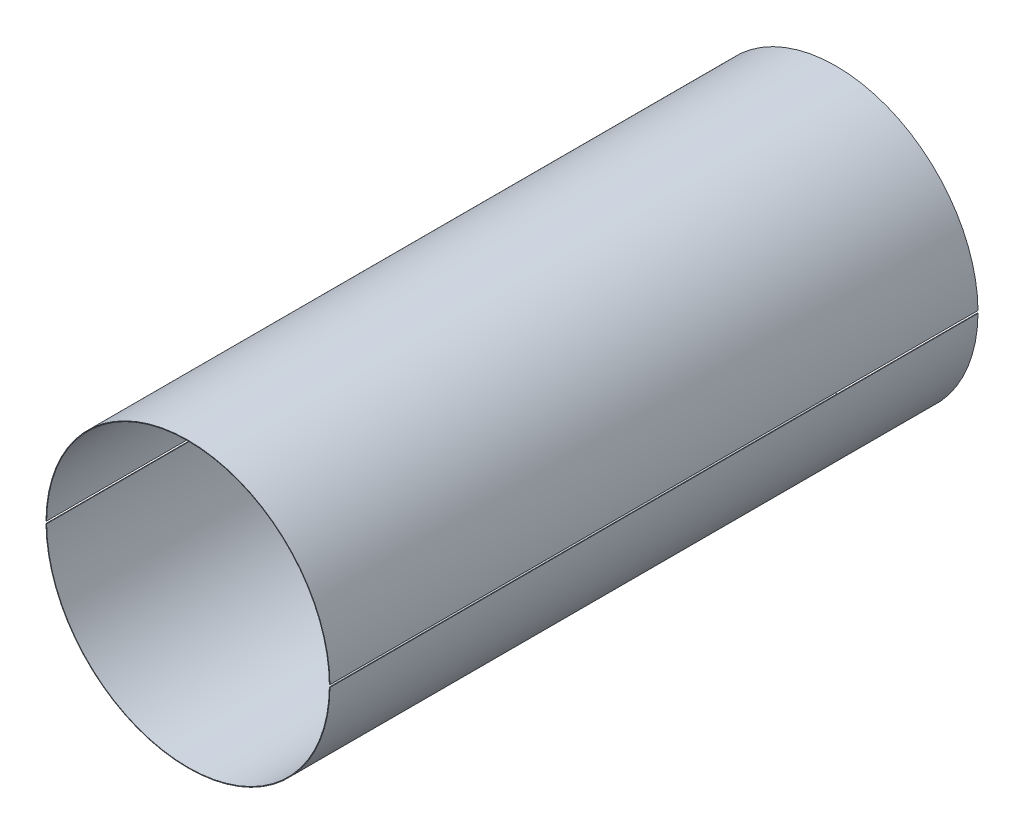
ISO-10303-21;
HEADER;
FILE_DESCRIPTION(('STEP AP214'),'2;1');
FILE_NAME('part.step','',(''),(''),'','','');
FILE_SCHEMA(('AUTOMOTIVE_DESIGN { 1 0 10303 214 1 1 1 1 }'));
ENDSEC;
DATA;
#1=APPLICATION_CONTEXT('core data for automotive mechanical design processes');
#2=APPLICATION_PROTOCOL_DEFINITION('international standard','automotive_design',2000,#1);
#3=PRODUCT_CONTEXT('',#1,'mechanical');
#4=PRODUCT('Part','Part','',(#3));
#5=PRODUCT_RELATED_PRODUCT_CATEGORY('part','',(#4));
#6=PRODUCT_DEFINITION_FORMATION('','',#4);
#7=PRODUCT_DEFINITION_CONTEXT('part definition',#1,'design');
#8=PRODUCT_DEFINITION('design','',#6,#7);
#9=PRODUCT_DEFINITION_SHAPE('','',#8);
#10=(LENGTH_UNIT() NAMED_UNIT(*) SI_UNIT(.MILLI.,.METRE.));
#11=(NAMED_UNIT(*) PLANE_ANGLE_UNIT() SI_UNIT($,.RADIAN.));
#12=(NAMED_UNIT(*) SI_UNIT($,.STERADIAN.) SOLID_ANGLE_UNIT());
#13=UNCERTAINTY_MEASURE_WITH_UNIT(LENGTH_MEASURE(1.E-05),#10,'distance_accuracy_value','');
#14=(GEOMETRIC_REPRESENTATION_CONTEXT(3) GLOBAL_UNCERTAINTY_ASSIGNED_CONTEXT((#13)) GLOBAL_UNIT_ASSIGNED_CONTEXT((#10,
#11,#12)) REPRESENTATION_CONTEXT('',''));
#15=CARTESIAN_POINT('',(0.,0.,0.));
#16=DIRECTION('',(0.,0.,1.));
#17=DIRECTION('',(1.,0.,0.));
#18=AXIS2_PLACEMENT_3D('',#15,#16,#17);
#19=CARTESIAN_POINT('',(0.,0.,279.4));
#20=DIRECTION('',(0.,0.,1.));
#21=DIRECTION('',(1.,0.,0.));
#22=AXIS2_PLACEMENT_3D('',#19,#20,#21);
#23=PLANE('',#22);
#24=DIRECTION('',(-1.,0.,0.));
#25=VECTOR('',#24,1.);
#26=CARTESIAN_POINT('',(61.214,0.507999999999995,279.4));
#27=LINE('',#26,#25);
#28=CARTESIAN_POINT('',(61.2118920798892,0.507999999999994,279.4));
#29=VERTEX_POINT('',#28);
#30=CARTESIAN_POINT('',(60.9578832965844,0.507999999999994,279.4));
#31=VERTEX_POINT('',#30);
#32=EDGE_CURVE('E50',#29,#31,#27,.T.);
#33=ORIENTED_EDGE('',*,*,#32,.F.);
#34=CARTESIAN_POINT('',(0.,0.,279.4));
#35=DIRECTION('',(0.,0.,1.));
#36=DIRECTION('',(1.,0.,0.));
#37=AXIS2_PLACEMENT_3D('',#34,#35,#36);
#38=CIRCLE('',#37,61.214);
#39=CARTESIAN_POINT('',(-61.2118920798892,0.507999999999994,279.4));
#40=VERTEX_POINT('',#39);
#41=EDGE_CURVE('E105',#29,#40,#38,.T.);
#42=ORIENTED_EDGE('',*,*,#41,.T.);
#43=CARTESIAN_POINT('',(-60.9578832965844,0.507999999999994,279.4));
#44=VERTEX_POINT('',#43);
#45=EDGE_CURVE('E87',#44,#40,#27,.T.);
#46=ORIENTED_EDGE('',*,*,#45,.F.);
#47=CARTESIAN_POINT('',(0.,0.,279.4));
#48=DIRECTION('',(0.,0.,1.));
#49=DIRECTION('',(1.,0.,0.));
#50=AXIS2_PLACEMENT_3D('',#47,#48,#49);
#51=CIRCLE('',#50,60.96);
#52=EDGE_CURVE('E92',#31,#44,#51,.T.);
#53=ORIENTED_EDGE('',*,*,#52,.F.);
#54=EDGE_LOOP('',(#33,#42,#46,#53));
#55=FACE_BOUND('',#54,.T.);
#56=ADVANCED_FACE('F42',(#55),#23,.T.);
#57=CARTESIAN_POINT('',(0.,0.,0.));
#58=DIRECTION('',(0.,0.,1.));
#59=DIRECTION('',(1.,0.,0.));
#60=AXIS2_PLACEMENT_3D('',#57,#58,#59);
#61=PLANE('',#60);
#62=CARTESIAN_POINT('',(0.,0.,0.));
#63=DIRECTION('',(0.,0.,1.));
#64=DIRECTION('',(1.,0.,0.));
#65=AXIS2_PLACEMENT_3D('',#62,#63,#64);
#66=CIRCLE('',#65,61.214);
#67=CARTESIAN_POINT('',(61.2118920798892,0.508000000000002,0.));
#68=VERTEX_POINT('',#67);
#69=CARTESIAN_POINT('',(-61.2118920798892,0.508000000000002,0.));
#70=VERTEX_POINT('',#69);
#71=EDGE_CURVE('E93',#68,#70,#66,.T.);
#72=ORIENTED_EDGE('',*,*,#71,.F.);
#73=DIRECTION('',(-1.,0.,0.));
#74=VECTOR('',#73,1.);
#75=CARTESIAN_POINT('',(61.214,0.508000000000002,0.));
#76=LINE('',#75,#74);
#77=CARTESIAN_POINT('',(60.9578832965844,0.508000000000002,0.));
#78=VERTEX_POINT('',#77);
#79=EDGE_CURVE('E63',#68,#78,#76,.T.);
#80=ORIENTED_EDGE('',*,*,#79,.T.);
#81=CARTESIAN_POINT('',(0.,0.,0.));
#82=DIRECTION('',(0.,0.,1.));
#83=DIRECTION('',(1.,0.,0.));
#84=AXIS2_PLACEMENT_3D('',#81,#82,#83);
#85=CIRCLE('',#84,60.96);
#86=CARTESIAN_POINT('',(-60.9578832965844,0.507999999999994,0.));
#87=VERTEX_POINT('',#86);
#88=EDGE_CURVE('E45',#78,#87,#85,.T.);
#89=ORIENTED_EDGE('',*,*,#88,.T.);
#90=EDGE_CURVE('E82',#87,#70,#76,.T.);
#91=ORIENTED_EDGE('',*,*,#90,.T.);
#92=EDGE_LOOP('',(#72,#80,#89,#91));
#93=FACE_BOUND('',#92,.T.);
#94=ADVANCED_FACE('F98',(#93),#61,.F.);
#95=CARTESIAN_POINT('',(0.,0.,279.4));
#96=DIRECTION('',(0.,0.,-1.));
#97=DIRECTION('',(-1.,0.,0.));
#98=AXIS2_PLACEMENT_3D('',#95,#96,#97);
#99=CYLINDRICAL_SURFACE('',#98,61.214);
#100=ORIENTED_EDGE('',*,*,#41,.F.);
#101=DIRECTION('',(0.,0.,-1.));
#102=VECTOR('',#101,1.);
#103=CARTESIAN_POINT('',(61.2118920798892,0.507999999999994,279.4));
#104=LINE('',#103,#102);
#105=EDGE_CURVE('E58',#29,#68,#104,.T.);
#106=ORIENTED_EDGE('',*,*,#105,.T.);
#107=ORIENTED_EDGE('',*,*,#71,.T.);
#108=DIRECTION('',(0.,0.,-1.));
#109=VECTOR('',#108,1.);
#110=CARTESIAN_POINT('',(-61.2118920798892,0.507999999999994,279.4));
#111=LINE('',#110,#109);
#112=EDGE_CURVE('E85',#70,#40,#111,.F.);
#113=ORIENTED_EDGE('',*,*,#112,.T.);
#114=EDGE_LOOP('',(#100,#106,#107,#113));
#115=FACE_BOUND('',#114,.T.);
#116=ADVANCED_FACE('F101',(#115),#99,.T.);
#117=CARTESIAN_POINT('',(0.,0.,279.4));
#118=DIRECTION('',(0.,0.,-1.));
#119=DIRECTION('',(-1.,0.,0.));
#120=AXIS2_PLACEMENT_3D('',#117,#118,#119);
#121=CYLINDRICAL_SURFACE('',#120,60.96);
#122=DIRECTION('',(0.,0.,-1.));
#123=VECTOR('',#122,1.);
#124=CARTESIAN_POINT('',(60.9578832965844,0.507999999999994,279.4));
#125=LINE('',#124,#123);
#126=EDGE_CURVE('E12',#31,#78,#125,.T.);
#127=ORIENTED_EDGE('',*,*,#126,.F.);
#128=ORIENTED_EDGE('',*,*,#52,.T.);
#129=DIRECTION('',(0.,0.,-1.));
#130=VECTOR('',#129,1.);
#131=CARTESIAN_POINT('',(-60.9578832965844,0.507999999999994,279.4));
#132=LINE('',#131,#130);
#133=EDGE_CURVE('E77',#87,#44,#132,.F.);
#134=ORIENTED_EDGE('',*,*,#133,.F.);
#135=ORIENTED_EDGE('',*,*,#88,.F.);
#136=EDGE_LOOP('',(#127,#128,#134,#135));
#137=FACE_BOUND('',#136,.T.);
#138=ADVANCED_FACE('F114',(#137),#121,.F.);
#139=CARTESIAN_POINT('',(61.214,0.508000000000002,0.));
#140=DIRECTION('',(0.,1.,0.));
#141=DIRECTION('',(0.,0.,1.));
#142=AXIS2_PLACEMENT_3D('',#139,#140,#141);
#143=PLANE('',#142);
#144=ORIENTED_EDGE('',*,*,#90,.F.);
#145=ORIENTED_EDGE('',*,*,#133,.T.);
#146=ORIENTED_EDGE('',*,*,#45,.T.);
#147=ORIENTED_EDGE('',*,*,#112,.F.);
#148=EDGE_LOOP('',(#144,#145,#146,#147));
#149=FACE_BOUND('',#148,.T.);
#150=ADVANCED_FACE('F86',(#149),#143,.F.);
#151=ORIENTED_EDGE('',*,*,#32,.T.);
#152=ORIENTED_EDGE('',*,*,#126,.T.);
#153=ORIENTED_EDGE('',*,*,#79,.F.);
#154=ORIENTED_EDGE('',*,*,#105,.F.);
#155=EDGE_LOOP('',(#151,#152,#153,#154));
#156=FACE_BOUND('',#155,.T.);
#157=ADVANCED_FACE('F112',(#156),#143,.F.);
#158=CLOSED_SHELL('',(#56,#94,#116,#138,#150,#157));
#159=MANIFOLD_SOLID_BREP('B2',#158);
#160=CARTESIAN_POINT('',(0.,0.,279.4));
#161=DIRECTION('',(0.,0.,-1.));
#162=DIRECTION('',(-1.,0.,0.));
#163=AXIS2_PLACEMENT_3D('',#160,#161,#162);
#164=CYLINDRICAL_SURFACE('',#163,60.96);
#165=DIRECTION('',(0.,0.,-1.));
#166=VECTOR('',#165,1.);
#167=CARTESIAN_POINT('',(-60.9578832965844,-0.507999999999994,279.4));
#168=LINE('',#167,#166);
#169=CARTESIAN_POINT('',(-60.9578832965844,-0.507999999999994,279.4));
#170=VERTEX_POINT('',#169);
#171=CARTESIAN_POINT('',(-60.9578832965843,-0.508000000000002,0.));
#172=VERTEX_POINT('',#171);
#173=EDGE_CURVE('E40',#170,#172,#168,.T.);
#174=ORIENTED_EDGE('',*,*,#173,.F.);
#175=CARTESIAN_POINT('',(0.,0.,279.4));
#176=DIRECTION('',(0.,0.,1.));
#177=DIRECTION('',(1.,0.,0.));
#178=AXIS2_PLACEMENT_3D('',#175,#176,#177);
#179=CIRCLE('',#178,60.96);
#180=CARTESIAN_POINT('',(60.9578832965844,-0.507999999999995,279.4));
#181=VERTEX_POINT('',#180);
#182=EDGE_CURVE('E220',#170,#181,#179,.T.);
#183=ORIENTED_EDGE('',*,*,#182,.T.);
#184=DIRECTION('',(0.,0.,-1.));
#185=VECTOR('',#184,1.);
#186=CARTESIAN_POINT('',(60.9578832965844,-0.507999999999994,279.4));
#187=LINE('',#186,#185);
#188=CARTESIAN_POINT('',(60.9578832965844,-0.507999999999994,0.));
#189=VERTEX_POINT('',#188);
#190=EDGE_CURVE('E170',#189,#181,#187,.F.);
#191=ORIENTED_EDGE('',*,*,#190,.F.);
#192=CARTESIAN_POINT('',(0.,0.,0.));
#193=DIRECTION('',(0.,0.,1.));
#194=DIRECTION('',(1.,0.,0.));
#195=AXIS2_PLACEMENT_3D('',#192,#193,#194);
#196=CIRCLE('',#195,60.96);
#197=EDGE_CURVE('E223',#172,#189,#196,.T.);
#198=ORIENTED_EDGE('',*,*,#197,.F.);
#199=EDGE_LOOP('',(#174,#183,#191,#198));
#200=FACE_BOUND('',#199,.T.);
#201=ADVANCED_FACE('F162',(#200),#164,.F.);
#202=CARTESIAN_POINT('',(0.,0.,279.4));
#203=DIRECTION('',(0.,0.,-1.));
#204=DIRECTION('',(-1.,0.,0.));
#205=AXIS2_PLACEMENT_3D('',#202,#203,#204);
#206=CYLINDRICAL_SURFACE('',#205,61.214);
#207=CARTESIAN_POINT('',(0.,0.,279.4));
#208=DIRECTION('',(0.,0.,1.));
#209=DIRECTION('',(1.,0.,0.));
#210=AXIS2_PLACEMENT_3D('',#207,#208,#209);
#211=CIRCLE('',#210,61.214);
#212=CARTESIAN_POINT('',(-61.2118920798892,-0.507999999999995,279.4));
#213=VERTEX_POINT('',#212);
#214=CARTESIAN_POINT('',(61.2118920798892,-0.507999999999995,279.4));
#215=VERTEX_POINT('',#214);
#216=EDGE_CURVE('E213',#213,#215,#211,.T.);
#217=ORIENTED_EDGE('',*,*,#216,.F.);
#218=DIRECTION('',(0.,0.,-1.));
#219=VECTOR('',#218,1.);
#220=CARTESIAN_POINT('',(-61.2118920798892,-0.507999999999994,279.4));
#221=LINE('',#220,#219);
#222=CARTESIAN_POINT('',(-61.2118920798892,-0.508000000000002,0.));
#223=VERTEX_POINT('',#222);
#224=EDGE_CURVE('E216',#213,#223,#221,.T.);
#225=ORIENTED_EDGE('',*,*,#224,.T.);
#226=CARTESIAN_POINT('',(0.,0.,0.));
#227=DIRECTION('',(0.,0.,1.));
#228=DIRECTION('',(1.,0.,0.));
#229=AXIS2_PLACEMENT_3D('',#226,#227,#228);
#230=CIRCLE('',#229,61.214);
#231=CARTESIAN_POINT('',(61.2118920798892,-0.508000000000002,0.));
#232=VERTEX_POINT('',#231);
#233=EDGE_CURVE('E215',#223,#232,#230,.T.);
#234=ORIENTED_EDGE('',*,*,#233,.T.);
#235=DIRECTION('',(0.,0.,-1.));
#236=VECTOR('',#235,1.);
#237=CARTESIAN_POINT('',(61.2118920798892,-0.507999999999994,279.4));
#238=LINE('',#237,#236);
#239=EDGE_CURVE('E203',#232,#215,#238,.F.);
#240=ORIENTED_EDGE('',*,*,#239,.T.);
#241=EDGE_LOOP('',(#217,#225,#234,#240));
#242=FACE_BOUND('',#241,.T.);
#243=ADVANCED_FACE('F164',(#242),#206,.T.);
#244=CARTESIAN_POINT('',(0.,0.,0.));
#245=DIRECTION('',(0.,0.,1.));
#246=DIRECTION('',(1.,0.,0.));
#247=AXIS2_PLACEMENT_3D('',#244,#245,#246);
#248=PLANE('',#247);
#249=ORIENTED_EDGE('',*,*,#233,.F.);
#250=DIRECTION('',(-1.,0.,0.));
#251=VECTOR('',#250,1.);
#252=CARTESIAN_POINT('',(61.214,-0.508000000000002,0.));
#253=LINE('',#252,#251);
#254=EDGE_CURVE('E228',#172,#223,#253,.T.);
#255=ORIENTED_EDGE('',*,*,#254,.F.);
#256=ORIENTED_EDGE('',*,*,#197,.T.);
#257=EDGE_CURVE('E177',#232,#189,#253,.T.);
#258=ORIENTED_EDGE('',*,*,#257,.F.);
#259=EDGE_LOOP('',(#249,#255,#256,#258));
#260=FACE_BOUND('',#259,.T.);
#261=ADVANCED_FACE('F233',(#260),#248,.F.);
#262=CARTESIAN_POINT('',(0.,0.,279.4));
#263=DIRECTION('',(0.,0.,1.));
#264=DIRECTION('',(1.,0.,0.));
#265=AXIS2_PLACEMENT_3D('',#262,#263,#264);
#266=PLANE('',#265);
#267=DIRECTION('',(-1.,0.,0.));
#268=VECTOR('',#267,1.);
#269=CARTESIAN_POINT('',(61.214,-0.507999999999995,279.4));
#270=LINE('',#269,#268);
#271=EDGE_CURVE('E184',#170,#213,#270,.T.);
#272=ORIENTED_EDGE('',*,*,#271,.T.);
#273=ORIENTED_EDGE('',*,*,#216,.T.);
#274=EDGE_CURVE('E200',#215,#181,#270,.T.);
#275=ORIENTED_EDGE('',*,*,#274,.T.);
#276=ORIENTED_EDGE('',*,*,#182,.F.);
#277=EDGE_LOOP('',(#272,#273,#275,#276));
#278=FACE_BOUND('',#277,.T.);
#279=ADVANCED_FACE('F218',(#278),#266,.T.);
#280=CARTESIAN_POINT('',(61.214,-0.508000000000002,0.));
#281=DIRECTION('',(0.,-1.,0.));
#282=DIRECTION('',(0.,0.,-1.));
#283=AXIS2_PLACEMENT_3D('',#280,#281,#282);
#284=PLANE('',#283);
#285=ORIENTED_EDGE('',*,*,#257,.T.);
#286=ORIENTED_EDGE('',*,*,#190,.T.);
#287=ORIENTED_EDGE('',*,*,#274,.F.);
#288=ORIENTED_EDGE('',*,*,#239,.F.);
#289=EDGE_LOOP('',(#285,#286,#287,#288));
#290=FACE_BOUND('',#289,.T.);
#291=ADVANCED_FACE('F202',(#290),#284,.F.);
#292=ORIENTED_EDGE('',*,*,#271,.F.);
#293=ORIENTED_EDGE('',*,*,#173,.T.);
#294=ORIENTED_EDGE('',*,*,#254,.T.);
#295=ORIENTED_EDGE('',*,*,#224,.F.);
#296=EDGE_LOOP('',(#292,#293,#294,#295));
#297=FACE_BOUND('',#296,.T.);
#298=ADVANCED_FACE('F230',(#297),#284,.F.);
#299=CLOSED_SHELL('',(#201,#243,#261,#279,#291,#298));
#300=MANIFOLD_SOLID_BREP('B6',#299);
#301=ADVANCED_BREP_SHAPE_REPRESENTATION('',(#18,#159,#300),#14);
#302=SHAPE_DEFINITION_REPRESENTATION(#9,#301);
ENDSEC;
END-ISO-10303-21;
